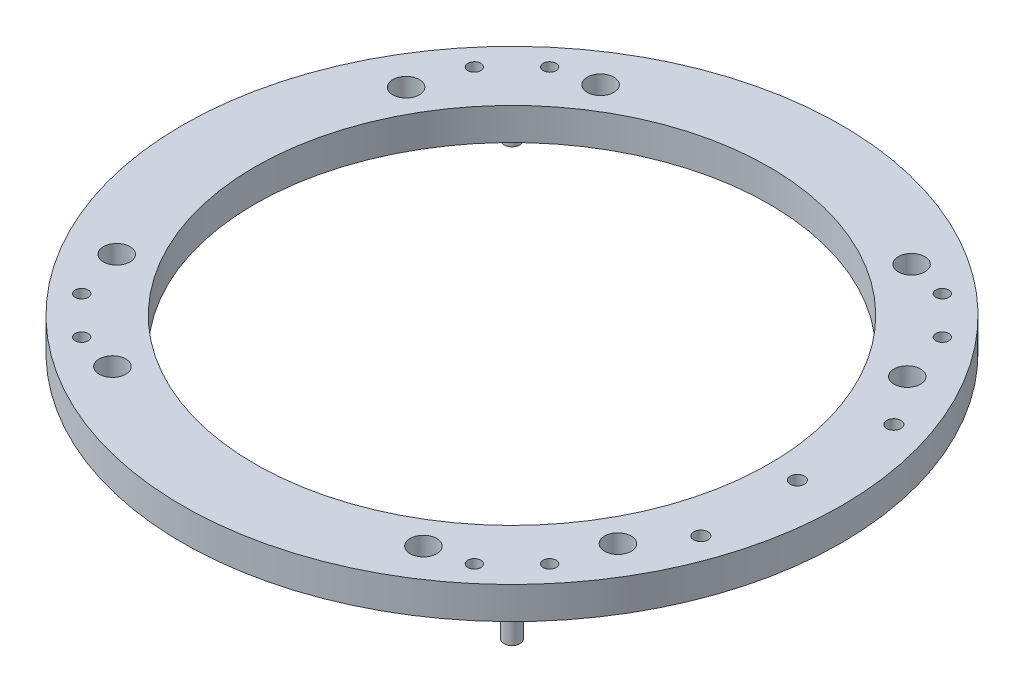
ISO-10303-21;
HEADER;
FILE_DESCRIPTION(('STEP AP214'),'2;1');
FILE_NAME('part.step','',(''),(''),'','','');
FILE_SCHEMA(('AUTOMOTIVE_DESIGN { 1 0 10303 214 1 1 1 1 }'));
ENDSEC;
DATA;
#1=APPLICATION_CONTEXT('core data for automotive mechanical design processes');
#2=APPLICATION_PROTOCOL_DEFINITION('international standard','automotive_design',2000,#1);
#3=PRODUCT_CONTEXT('',#1,'mechanical');
#4=PRODUCT('Part','Part','',(#3));
#5=PRODUCT_RELATED_PRODUCT_CATEGORY('part','',(#4));
#6=PRODUCT_DEFINITION_FORMATION('','',#4);
#7=PRODUCT_DEFINITION_CONTEXT('part definition',#1,'design');
#8=PRODUCT_DEFINITION('design','',#6,#7);
#9=PRODUCT_DEFINITION_SHAPE('','',#8);
#10=(LENGTH_UNIT() NAMED_UNIT(*) SI_UNIT(.MILLI.,.METRE.));
#11=(NAMED_UNIT(*) PLANE_ANGLE_UNIT() SI_UNIT($,.RADIAN.));
#12=(NAMED_UNIT(*) SI_UNIT($,.STERADIAN.) SOLID_ANGLE_UNIT());
#13=UNCERTAINTY_MEASURE_WITH_UNIT(LENGTH_MEASURE(1.E-05),#10,'distance_accuracy_value','');
#14=(GEOMETRIC_REPRESENTATION_CONTEXT(3) GLOBAL_UNCERTAINTY_ASSIGNED_CONTEXT((#13)) GLOBAL_UNIT_ASSIGNED_CONTEXT((#10,
#11,#12)) REPRESENTATION_CONTEXT('',''));
#15=CARTESIAN_POINT('',(0.,0.,0.));
#16=DIRECTION('',(0.,0.,1.));
#17=DIRECTION('',(1.,0.,0.));
#18=AXIS2_PLACEMENT_3D('',#15,#16,#17);
#19=CARTESIAN_POINT('',(0.,1057.275,0.));
#20=DIRECTION('',(0.,1.,0.));
#21=DIRECTION('',(-1.,0.,0.));
#22=AXIS2_PLACEMENT_3D('',#19,#20,#21);
#23=PLANE('',#22);
#24=CARTESIAN_POINT('',(-98.9867036525652,1057.275,57.1499999999999));
#25=DIRECTION('',(0.,1.,0.));
#26=DIRECTION('',(-1.,0.,0.));
#27=AXIS2_PLACEMENT_3D('',#24,#25,#26);
#28=CIRCLE('',#27,5.2451);
#29=CARTESIAN_POINT('',(-104.231803652565,1057.275,57.1499999999999));
#30=VERTEX_POINT('',#29);
#31=EDGE_CURVE('E394',#30,#30,#28,.T.);
#32=ORIENTED_EDGE('',*,*,#31,.T.);
#33=EDGE_LOOP('',(#32));
#34=FACE_BOUND('',#33,.T.);
#35=CARTESIAN_POINT('',(98.9867036525577,1057.275,57.1499999999999));
#36=DIRECTION('',(0.,1.,0.));
#37=DIRECTION('',(-1.,0.,0.));
#38=AXIS2_PLACEMENT_3D('',#35,#36,#37);
#39=CIRCLE('',#38,5.2451);
#40=CARTESIAN_POINT('',(93.7416036525577,1057.275,57.1499999999999));
#41=VERTEX_POINT('',#40);
#42=EDGE_CURVE('E398',#41,#41,#39,.T.);
#43=ORIENTED_EDGE('',*,*,#42,.T.);
#44=EDGE_LOOP('',(#43));
#45=FACE_BOUND('',#44,.T.);
#46=CARTESIAN_POINT('',(98.9867036525576,1057.275,-57.1499999999998));
#47=DIRECTION('',(0.,1.,0.));
#48=DIRECTION('',(-1.,0.,0.));
#49=AXIS2_PLACEMENT_3D('',#46,#47,#48);
#50=CIRCLE('',#49,5.2451);
#51=CARTESIAN_POINT('',(93.7416036525576,1057.275,-57.1499999999998));
#52=VERTEX_POINT('',#51);
#53=EDGE_CURVE('E405',#52,#52,#50,.T.);
#54=ORIENTED_EDGE('',*,*,#53,.T.);
#55=EDGE_LOOP('',(#54));
#56=FACE_BOUND('',#55,.T.);
#57=CARTESIAN_POINT('',(-98.9867036525651,1057.275,-57.1499999999998));
#58=DIRECTION('',(0.,1.,0.));
#59=DIRECTION('',(-1.,0.,0.));
#60=AXIS2_PLACEMENT_3D('',#57,#58,#59);
#61=CIRCLE('',#60,5.2451);
#62=CARTESIAN_POINT('',(-104.231803652565,1057.275,-57.1499999999998));
#63=VERTEX_POINT('',#62);
#64=EDGE_CURVE('E43',#63,#63,#61,.T.);
#65=ORIENTED_EDGE('',*,*,#64,.T.);
#66=EDGE_LOOP('',(#65));
#67=FACE_BOUND('',#66,.T.);
#68=CARTESIAN_POINT('',(-61.4133452340455,1057.275,-96.399642256413));
#69=DIRECTION('',(0.,1.,0.));
#70=DIRECTION('',(-1.,0.,0.));
#71=AXIS2_PLACEMENT_3D('',#68,#69,#70);
#72=CIRCLE('',#71,5.2451);
#73=CARTESIAN_POINT('',(-66.6584452340455,1057.275,-96.399642256413));
#74=VERTEX_POINT('',#73);
#75=EDGE_CURVE('E83',#74,#74,#72,.T.);
#76=ORIENTED_EDGE('',*,*,#75,.T.);
#77=EDGE_LOOP('',(#76));
#78=FACE_BOUND('',#77,.T.);
#79=CARTESIAN_POINT('',(61.413345234038,1057.275,-96.399642256413));
#80=DIRECTION('',(0.,1.,0.));
#81=DIRECTION('',(-1.,0.,0.));
#82=AXIS2_PLACEMENT_3D('',#79,#80,#81);
#83=CIRCLE('',#82,5.2451);
#84=CARTESIAN_POINT('',(56.168245234038,1057.275,-96.399642256413));
#85=VERTEX_POINT('',#84);
#86=EDGE_CURVE('E73',#85,#85,#83,.T.);
#87=ORIENTED_EDGE('',*,*,#86,.T.);
#88=EDGE_LOOP('',(#87));
#89=FACE_BOUND('',#88,.T.);
#90=CARTESIAN_POINT('',(61.413345234038,1057.275,96.399642256413));
#91=DIRECTION('',(0.,1.,0.));
#92=DIRECTION('',(-1.,0.,0.));
#93=AXIS2_PLACEMENT_3D('',#90,#91,#92);
#94=CIRCLE('',#93,5.2451);
#95=CARTESIAN_POINT('',(56.1682452340381,1057.275,96.399642256413));
#96=VERTEX_POINT('',#95);
#97=EDGE_CURVE('E80',#96,#96,#94,.T.);
#98=ORIENTED_EDGE('',*,*,#97,.T.);
#99=EDGE_LOOP('',(#98));
#100=FACE_BOUND('',#99,.T.);
#101=CARTESIAN_POINT('',(-61.4133452340455,1057.275,96.399642256413));
#102=DIRECTION('',(0.,1.,0.));
#103=DIRECTION('',(-1.,0.,0.));
#104=AXIS2_PLACEMENT_3D('',#101,#102,#103);
#105=CIRCLE('',#104,5.2451);
#106=CARTESIAN_POINT('',(-66.6584452340455,1057.275,96.399642256413));
#107=VERTEX_POINT('',#106);
#108=EDGE_CURVE('E69',#107,#107,#105,.T.);
#109=ORIENTED_EDGE('',*,*,#108,.T.);
#110=EDGE_LOOP('',(#109));
#111=FACE_BOUND('',#110,.T.);
#112=CARTESIAN_POINT('',(112.712499999997,1057.275,-38.1));
#113=DIRECTION('',(0.,1.,0.));
#114=DIRECTION('',(-1.,0.,0.));
#115=AXIS2_PLACEMENT_3D('',#112,#113,#114);
#116=CIRCLE('',#115,2.80669999999999);
#117=CARTESIAN_POINT('',(109.905799999997,1057.275,-38.1));
#118=VERTEX_POINT('',#117);
#119=EDGE_CURVE('E65',#118,#118,#116,.T.);
#120=ORIENTED_EDGE('',*,*,#119,.T.);
#121=EDGE_LOOP('',(#120));
#122=FACE_BOUND('',#121,.T.);
#123=CARTESIAN_POINT('',(112.712499999997,1057.275,0.));
#124=DIRECTION('',(0.,1.,0.));
#125=DIRECTION('',(-1.,0.,0.));
#126=AXIS2_PLACEMENT_3D('',#123,#124,#125);
#127=CIRCLE('',#126,2.8067);
#128=CARTESIAN_POINT('',(109.905799999997,1057.275,0.));
#129=VERTEX_POINT('',#128);
#130=EDGE_CURVE('E61',#129,#129,#127,.T.);
#131=ORIENTED_EDGE('',*,*,#130,.T.);
#132=EDGE_LOOP('',(#131));
#133=FACE_BOUND('',#132,.T.);
#134=CARTESIAN_POINT('',(112.712499999997,1057.275,38.1));
#135=DIRECTION('',(0.,1.,0.));
#136=DIRECTION('',(-1.,0.,0.));
#137=AXIS2_PLACEMENT_3D('',#134,#135,#136);
#138=CIRCLE('',#137,2.8067);
#139=CARTESIAN_POINT('',(109.905799999997,1057.275,38.1));
#140=VERTEX_POINT('',#139);
#141=EDGE_CURVE('E56',#140,#140,#138,.T.);
#142=ORIENTED_EDGE('',*,*,#141,.T.);
#143=EDGE_LOOP('',(#142));
#144=FACE_BOUND('',#143,.T.);
#145=CARTESIAN_POINT('',(92.4232620623001,1057.275,-77.5523251086821));
#146=DIRECTION('',(0.,-1.,0.));
#147=DIRECTION('',(0.,0.,-1.));
#148=AXIS2_PLACEMENT_3D('',#145,#146,#147);
#149=CIRCLE('',#148,2.55269999999999);
#150=CARTESIAN_POINT('',(92.4232620623001,1057.275,-80.1050251086821));
#151=VERTEX_POINT('',#150);
#152=EDGE_CURVE('E59',#151,#151,#149,.T.);
#153=ORIENTED_EDGE('',*,*,#152,.F.);
#154=EDGE_LOOP('',(#153));
#155=FACE_BOUND('',#154,.T.);
#156=CARTESIAN_POINT('',(77.5523251086762,1057.275,-92.4232620623057));
#157=DIRECTION('',(0.,-1.,0.));
#158=DIRECTION('',(0.,0.,-1.));
#159=AXIS2_PLACEMENT_3D('',#156,#157,#158);
#160=CIRCLE('',#159,2.55269999999999);
#161=CARTESIAN_POINT('',(77.5523251086762,1057.275,-94.9759620623057));
#162=VERTEX_POINT('',#161);
#163=EDGE_CURVE('E107',#162,#162,#160,.T.);
#164=ORIENTED_EDGE('',*,*,#163,.F.);
#165=EDGE_LOOP('',(#164));
#166=FACE_BOUND('',#165,.T.);
#167=CARTESIAN_POINT('',(77.5523251086775,1057.275,92.4232620623047));
#168=DIRECTION('',(0.,-1.,0.));
#169=DIRECTION('',(0.,0.,-1.));
#170=AXIS2_PLACEMENT_3D('',#167,#168,#169);
#171=CIRCLE('',#170,2.55269999999999);
#172=CARTESIAN_POINT('',(77.5523251086775,1057.275,89.8705620623047));
#173=VERTEX_POINT('',#172);
#174=EDGE_CURVE('E113',#173,#173,#171,.T.);
#175=ORIENTED_EDGE('',*,*,#174,.F.);
#176=EDGE_LOOP('',(#175));
#177=FACE_BOUND('',#176,.T.);
#178=CARTESIAN_POINT('',(92.4232620623012,1057.275,77.5523251086808));
#179=DIRECTION('',(0.,-1.,0.));
#180=DIRECTION('',(0.,0.,-1.));
#181=AXIS2_PLACEMENT_3D('',#178,#179,#180);
#182=CIRCLE('',#181,2.55269999999999);
#183=CARTESIAN_POINT('',(92.4232620623012,1057.275,74.9996251086808));
#184=VERTEX_POINT('',#183);
#185=EDGE_CURVE('E119',#184,#184,#182,.T.);
#186=ORIENTED_EDGE('',*,*,#185,.F.);
#187=EDGE_LOOP('',(#186));
#188=FACE_BOUND('',#187,.T.);
#189=CARTESIAN_POINT('',(-92.4232620623081,1057.275,77.5523251086815));
#190=DIRECTION('',(0.,-1.,0.));
#191=DIRECTION('',(0.,0.,-1.));
#192=AXIS2_PLACEMENT_3D('',#189,#190,#191);
#193=CIRCLE('',#192,2.55269999999999);
#194=CARTESIAN_POINT('',(-92.4232620623081,1057.275,74.9996251086815));
#195=VERTEX_POINT('',#194);
#196=EDGE_CURVE('E125',#195,#195,#193,.T.);
#197=ORIENTED_EDGE('',*,*,#196,.F.);
#198=EDGE_LOOP('',(#197));
#199=FACE_BOUND('',#198,.T.);
#200=CARTESIAN_POINT('',(-77.5523251086848,1057.275,-92.4232620623047));
#201=DIRECTION('',(0.,-1.,0.));
#202=DIRECTION('',(0.,0.,-1.));
#203=AXIS2_PLACEMENT_3D('',#200,#201,#202);
#204=CIRCLE('',#203,2.55269999999999);
#205=CARTESIAN_POINT('',(-77.5523251086848,1057.275,-94.9759620623046));
#206=VERTEX_POINT('',#205);
#207=EDGE_CURVE('E140',#206,#206,#204,.T.);
#208=ORIENTED_EDGE('',*,*,#207,.F.);
#209=EDGE_LOOP('',(#208));
#210=FACE_BOUND('',#209,.T.);
#211=CARTESIAN_POINT('',(-92.4232620623086,1057.275,-77.5523251086808));
#212=DIRECTION('',(0.,-1.,0.));
#213=DIRECTION('',(0.,0.,-1.));
#214=AXIS2_PLACEMENT_3D('',#211,#212,#213);
#215=CIRCLE('',#214,2.55269999999999);
#216=CARTESIAN_POINT('',(-92.4232620623086,1057.275,-80.1050251086808));
#217=VERTEX_POINT('',#216);
#218=EDGE_CURVE('E146',#217,#217,#215,.T.);
#219=ORIENTED_EDGE('',*,*,#218,.F.);
#220=EDGE_LOOP('',(#219));
#221=FACE_BOUND('',#220,.T.);
#222=CARTESIAN_POINT('',(-85.3124331501608,1057.275,-85.3124331501569));
#223=DIRECTION('',(0.,1.,0.));
#224=DIRECTION('',(-1.,0.,0.));
#225=AXIS2_PLACEMENT_3D('',#222,#223,#224);
#226=CIRCLE('',#225,3.175);
#227=CARTESIAN_POINT('',(-88.4874331501608,1057.275,-85.3124331501569));
#228=VERTEX_POINT('',#227);
#229=EDGE_CURVE('E10',#228,#228,#226,.F.);
#230=ORIENTED_EDGE('',*,*,#229,.F.);
#231=EDGE_LOOP('',(#230));
#232=FACE_BOUND('',#231,.T.);
#233=CARTESIAN_POINT('',(85.3124331501531,1057.275,-85.3124331501571));
#234=DIRECTION('',(0.,1.,0.));
#235=DIRECTION('',(-1.,0.,0.));
#236=AXIS2_PLACEMENT_3D('',#233,#234,#235);
#237=CIRCLE('',#236,3.175);
#238=CARTESIAN_POINT('',(82.1374331501531,1057.275,-85.3124331501571));
#239=VERTEX_POINT('',#238);
#240=EDGE_CURVE('E47',#239,#239,#237,.F.);
#241=ORIENTED_EDGE('',*,*,#240,.F.);
#242=EDGE_LOOP('',(#241));
#243=FACE_BOUND('',#242,.T.);
#244=CARTESIAN_POINT('',(85.3124331501534,1057.275,85.3124331501568));
#245=DIRECTION('',(0.,1.,0.));
#246=DIRECTION('',(-1.,0.,0.));
#247=AXIS2_PLACEMENT_3D('',#244,#245,#246);
#248=CIRCLE('',#247,3.175);
#249=CARTESIAN_POINT('',(82.1374331501534,1057.275,85.3124331501568));
#250=VERTEX_POINT('',#249);
#251=EDGE_CURVE('E52',#250,#250,#248,.F.);
#252=ORIENTED_EDGE('',*,*,#251,.F.);
#253=EDGE_LOOP('',(#252));
#254=FACE_BOUND('',#253,.T.);
#255=CARTESIAN_POINT('',(-85.3124331501605,1057.275,85.3124331501571));
#256=DIRECTION('',(0.,1.,0.));
#257=DIRECTION('',(-1.,0.,0.));
#258=AXIS2_PLACEMENT_3D('',#255,#256,#257);
#259=CIRCLE('',#258,3.175);
#260=CARTESIAN_POINT('',(-88.4874331501605,1057.275,85.3124331501571));
#261=VERTEX_POINT('',#260);
#262=EDGE_CURVE('E181',#261,#261,#259,.F.);
#263=ORIENTED_EDGE('',*,*,#262,.F.);
#264=EDGE_LOOP('',(#263));
#265=FACE_BOUND('',#264,.T.);
#266=CARTESIAN_POINT('',(-3.69750480233591E-12,1057.275,0.));
#267=DIRECTION('',(0.,1.,0.));
#268=DIRECTION('',(-1.,0.,0.));
#269=AXIS2_PLACEMENT_3D('',#266,#267,#268);
#270=CIRCLE('',#269,130.175000000004);
#271=CARTESIAN_POINT('',(-130.175000000008,1057.275,0.));
#272=VERTEX_POINT('',#271);
#273=EDGE_CURVE('E165',#272,#272,#270,.T.);
#274=ORIENTED_EDGE('',*,*,#273,.F.);
#275=EDGE_LOOP('',(#274));
#276=FACE_BOUND('',#275,.T.);
#277=CARTESIAN_POINT('',(-3.69750480233591E-12,1057.275,0.));
#278=DIRECTION('',(0.,1.,0.));
#279=DIRECTION('',(-1.,0.,0.));
#280=AXIS2_PLACEMENT_3D('',#277,#278,#279);
#281=CIRCLE('',#280,101.600000000001);
#282=CARTESIAN_POINT('',(-101.600000000004,1057.275,0.));
#283=VERTEX_POINT('',#282);
#284=EDGE_CURVE('E169',#283,#283,#281,.T.);
#285=ORIENTED_EDGE('',*,*,#284,.T.);
#286=EDGE_LOOP('',(#285));
#287=FACE_BOUND('',#286,.T.);
#288=CARTESIAN_POINT('',(-77.5523251086842,1057.275,92.4232620623052));
#289=DIRECTION('',(0.,-1.,0.));
#290=DIRECTION('',(0.,0.,-1.));
#291=AXIS2_PLACEMENT_3D('',#288,#289,#290);
#292=CIRCLE('',#291,2.55269999999999);
#293=CARTESIAN_POINT('',(-77.5523251086842,1057.275,89.8705620623052));
#294=VERTEX_POINT('',#293);
#295=EDGE_CURVE('E132',#294,#294,#292,.T.);
#296=ORIENTED_EDGE('',*,*,#295,.F.);
#297=EDGE_LOOP('',(#296));
#298=FACE_BOUND('',#297,.T.);
#299=ADVANCED_FACE('F39',(#34,#45,#56,#67,#78,#89,#100,#111,#122,#133,#144,#155,#166,#177,#188,
#199,#210,#221,#232,#243,#254,#265,#276,#287,#298),#23,.F.);
#300=CARTESIAN_POINT('',(0.,1069.975,0.));
#301=DIRECTION('',(0.,1.,0.));
#302=DIRECTION('',(-1.,0.,0.));
#303=AXIS2_PLACEMENT_3D('',#300,#301,#302);
#304=PLANE('',#303);
#305=CARTESIAN_POINT('',(-98.9867036525652,1069.975,57.1499999999999));
#306=DIRECTION('',(0.,1.,0.));
#307=DIRECTION('',(0.,0.,1.));
#308=AXIS2_PLACEMENT_3D('',#305,#306,#307);
#309=CIRCLE('',#308,5.2451);
#310=CARTESIAN_POINT('',(-98.9867036525652,1069.975,62.3950999999999));
#311=VERTEX_POINT('',#310);
#312=EDGE_CURVE('E267',#311,#311,#309,.T.);
#313=ORIENTED_EDGE('',*,*,#312,.F.);
#314=EDGE_LOOP('',(#313));
#315=FACE_BOUND('',#314,.T.);
#316=CARTESIAN_POINT('',(98.9867036525577,1069.975,57.1499999999999));
#317=DIRECTION('',(0.,1.,0.));
#318=DIRECTION('',(0.,0.,1.));
#319=AXIS2_PLACEMENT_3D('',#316,#317,#318);
#320=CIRCLE('',#319,5.2451);
#321=CARTESIAN_POINT('',(98.9867036525577,1069.975,62.3950999999999));
#322=VERTEX_POINT('',#321);
#323=EDGE_CURVE('E271',#322,#322,#320,.T.);
#324=ORIENTED_EDGE('',*,*,#323,.F.);
#325=EDGE_LOOP('',(#324));
#326=FACE_BOUND('',#325,.T.);
#327=CARTESIAN_POINT('',(98.9867036525576,1069.975,-57.1499999999998));
#328=DIRECTION('',(0.,1.,0.));
#329=DIRECTION('',(0.,0.,1.));
#330=AXIS2_PLACEMENT_3D('',#327,#328,#329);
#331=CIRCLE('',#330,5.2451);
#332=CARTESIAN_POINT('',(98.9867036525576,1069.975,-51.9048999999998));
#333=VERTEX_POINT('',#332);
#334=EDGE_CURVE('E275',#333,#333,#331,.T.);
#335=ORIENTED_EDGE('',*,*,#334,.F.);
#336=EDGE_LOOP('',(#335));
#337=FACE_BOUND('',#336,.T.);
#338=CARTESIAN_POINT('',(-98.9867036525651,1069.975,-57.1499999999998));
#339=DIRECTION('',(0.,1.,0.));
#340=DIRECTION('',(0.,0.,1.));
#341=AXIS2_PLACEMENT_3D('',#338,#339,#340);
#342=CIRCLE('',#341,5.2451);
#343=CARTESIAN_POINT('',(-98.9867036525651,1069.975,-51.9048999999998));
#344=VERTEX_POINT('',#343);
#345=EDGE_CURVE('E279',#344,#344,#342,.T.);
#346=ORIENTED_EDGE('',*,*,#345,.F.);
#347=EDGE_LOOP('',(#346));
#348=FACE_BOUND('',#347,.T.);
#349=CARTESIAN_POINT('',(-61.4133452340455,1069.975,-96.399642256413));
#350=DIRECTION('',(0.,1.,0.));
#351=DIRECTION('',(0.,0.,1.));
#352=AXIS2_PLACEMENT_3D('',#349,#350,#351);
#353=CIRCLE('',#352,5.2451);
#354=CARTESIAN_POINT('',(-61.4133452340455,1069.975,-91.154542256413));
#355=VERTEX_POINT('',#354);
#356=EDGE_CURVE('E88',#355,#355,#353,.T.);
#357=ORIENTED_EDGE('',*,*,#356,.F.);
#358=EDGE_LOOP('',(#357));
#359=FACE_BOUND('',#358,.T.);
#360=CARTESIAN_POINT('',(61.413345234038,1069.975,-96.399642256413));
#361=DIRECTION('',(0.,1.,0.));
#362=DIRECTION('',(0.,0.,1.));
#363=AXIS2_PLACEMENT_3D('',#360,#361,#362);
#364=CIRCLE('',#363,5.2451);
#365=CARTESIAN_POINT('',(61.413345234038,1069.975,-91.154542256413));
#366=VERTEX_POINT('',#365);
#367=EDGE_CURVE('E76',#366,#366,#364,.T.);
#368=ORIENTED_EDGE('',*,*,#367,.F.);
#369=EDGE_LOOP('',(#368));
#370=FACE_BOUND('',#369,.T.);
#371=CARTESIAN_POINT('',(61.413345234038,1069.975,96.399642256413));
#372=DIRECTION('',(0.,1.,0.));
#373=DIRECTION('',(0.,0.,1.));
#374=AXIS2_PLACEMENT_3D('',#371,#372,#373);
#375=CIRCLE('',#374,5.2451);
#376=CARTESIAN_POINT('',(61.413345234038,1069.975,101.644742256413));
#377=VERTEX_POINT('',#376);
#378=EDGE_CURVE('E75',#377,#377,#375,.T.);
#379=ORIENTED_EDGE('',*,*,#378,.F.);
#380=EDGE_LOOP('',(#379));
#381=FACE_BOUND('',#380,.T.);
#382=CARTESIAN_POINT('',(-61.4133452340455,1069.975,96.399642256413));
#383=DIRECTION('',(0.,1.,0.));
#384=DIRECTION('',(0.,0.,1.));
#385=AXIS2_PLACEMENT_3D('',#382,#383,#384);
#386=CIRCLE('',#385,5.2451);
#387=CARTESIAN_POINT('',(-61.4133452340455,1069.975,101.644742256413));
#388=VERTEX_POINT('',#387);
#389=EDGE_CURVE('E72',#388,#388,#386,.T.);
#390=ORIENTED_EDGE('',*,*,#389,.F.);
#391=EDGE_LOOP('',(#390));
#392=FACE_BOUND('',#391,.T.);
#393=CARTESIAN_POINT('',(112.712499999997,1069.975,-38.1));
#394=DIRECTION('',(0.,1.,0.));
#395=DIRECTION('',(0.,0.,1.));
#396=AXIS2_PLACEMENT_3D('',#393,#394,#395);
#397=CIRCLE('',#396,2.80669999999998);
#398=CARTESIAN_POINT('',(112.712499999997,1069.975,-35.2933));
#399=VERTEX_POINT('',#398);
#400=EDGE_CURVE('E68',#399,#399,#397,.T.);
#401=ORIENTED_EDGE('',*,*,#400,.F.);
#402=EDGE_LOOP('',(#401));
#403=FACE_BOUND('',#402,.T.);
#404=CARTESIAN_POINT('',(112.712499999997,1069.975,0.));
#405=DIRECTION('',(0.,1.,0.));
#406=DIRECTION('',(0.,0.,1.));
#407=AXIS2_PLACEMENT_3D('',#404,#405,#406);
#408=CIRCLE('',#407,2.8067);
#409=CARTESIAN_POINT('',(112.712499999997,1069.975,2.8067));
#410=VERTEX_POINT('',#409);
#411=EDGE_CURVE('E64',#410,#410,#408,.T.);
#412=ORIENTED_EDGE('',*,*,#411,.F.);
#413=EDGE_LOOP('',(#412));
#414=FACE_BOUND('',#413,.T.);
#415=CARTESIAN_POINT('',(112.712499999997,1069.975,38.1));
#416=DIRECTION('',(0.,1.,0.));
#417=DIRECTION('',(0.,0.,1.));
#418=AXIS2_PLACEMENT_3D('',#415,#416,#417);
#419=CIRCLE('',#418,2.8067);
#420=CARTESIAN_POINT('',(112.712499999997,1069.975,40.9067));
#421=VERTEX_POINT('',#420);
#422=EDGE_CURVE('E60',#421,#421,#419,.T.);
#423=ORIENTED_EDGE('',*,*,#422,.F.);
#424=EDGE_LOOP('',(#423));
#425=FACE_BOUND('',#424,.T.);
#426=CARTESIAN_POINT('',(92.4232620623001,1069.975,-77.5523251086821));
#427=DIRECTION('',(0.,-1.,0.));
#428=DIRECTION('',(0.,0.,-1.));
#429=AXIS2_PLACEMENT_3D('',#426,#427,#428);
#430=CIRCLE('',#429,2.55269999999999);
#431=CARTESIAN_POINT('',(92.4232620623001,1069.975,-80.1050251086821));
#432=VERTEX_POINT('',#431);
#433=EDGE_CURVE('E104',#432,#432,#430,.T.);
#434=ORIENTED_EDGE('',*,*,#433,.T.);
#435=EDGE_LOOP('',(#434));
#436=FACE_BOUND('',#435,.T.);
#437=CARTESIAN_POINT('',(77.5523251086762,1069.975,-92.4232620623057));
#438=DIRECTION('',(0.,-1.,0.));
#439=DIRECTION('',(0.,0.,-1.));
#440=AXIS2_PLACEMENT_3D('',#437,#438,#439);
#441=CIRCLE('',#440,2.55269999999999);
#442=CARTESIAN_POINT('',(77.5523251086762,1069.975,-94.9759620623057));
#443=VERTEX_POINT('',#442);
#444=EDGE_CURVE('E110',#443,#443,#441,.T.);
#445=ORIENTED_EDGE('',*,*,#444,.T.);
#446=EDGE_LOOP('',(#445));
#447=FACE_BOUND('',#446,.T.);
#448=CARTESIAN_POINT('',(77.5523251086775,1069.975,92.4232620623047));
#449=DIRECTION('',(0.,-1.,0.));
#450=DIRECTION('',(0.,0.,-1.));
#451=AXIS2_PLACEMENT_3D('',#448,#449,#450);
#452=CIRCLE('',#451,2.55269999999999);
#453=CARTESIAN_POINT('',(77.5523251086775,1069.975,89.8705620623047));
#454=VERTEX_POINT('',#453);
#455=EDGE_CURVE('E116',#454,#454,#452,.T.);
#456=ORIENTED_EDGE('',*,*,#455,.T.);
#457=EDGE_LOOP('',(#456));
#458=FACE_BOUND('',#457,.T.);
#459=CARTESIAN_POINT('',(92.4232620623012,1069.975,77.5523251086808));
#460=DIRECTION('',(0.,-1.,0.));
#461=DIRECTION('',(0.,0.,-1.));
#462=AXIS2_PLACEMENT_3D('',#459,#460,#461);
#463=CIRCLE('',#462,2.55269999999999);
#464=CARTESIAN_POINT('',(92.4232620623012,1069.975,74.9996251086808));
#465=VERTEX_POINT('',#464);
#466=EDGE_CURVE('E122',#465,#465,#463,.T.);
#467=ORIENTED_EDGE('',*,*,#466,.T.);
#468=EDGE_LOOP('',(#467));
#469=FACE_BOUND('',#468,.T.);
#470=CARTESIAN_POINT('',(-92.4232620623081,1069.975,77.5523251086815));
#471=DIRECTION('',(0.,-1.,0.));
#472=DIRECTION('',(0.,0.,-1.));
#473=AXIS2_PLACEMENT_3D('',#470,#471,#472);
#474=CIRCLE('',#473,2.55269999999999);
#475=CARTESIAN_POINT('',(-92.4232620623081,1069.975,74.9996251086815));
#476=VERTEX_POINT('',#475);
#477=EDGE_CURVE('E128',#476,#476,#474,.T.);
#478=ORIENTED_EDGE('',*,*,#477,.T.);
#479=EDGE_LOOP('',(#478));
#480=FACE_BOUND('',#479,.T.);
#481=CARTESIAN_POINT('',(-77.5523251086842,1069.975,92.4232620623052));
#482=DIRECTION('',(0.,-1.,0.));
#483=DIRECTION('',(0.,0.,-1.));
#484=AXIS2_PLACEMENT_3D('',#481,#482,#483);
#485=CIRCLE('',#484,2.55269999999999);
#486=CARTESIAN_POINT('',(-77.5523251086842,1069.975,89.8705620623052));
#487=VERTEX_POINT('',#486);
#488=EDGE_CURVE('E136',#487,#487,#485,.T.);
#489=ORIENTED_EDGE('',*,*,#488,.T.);
#490=EDGE_LOOP('',(#489));
#491=FACE_BOUND('',#490,.T.);
#492=CARTESIAN_POINT('',(-3.74191927443602E-12,1069.975,0.));
#493=DIRECTION('',(0.,1.,0.));
#494=DIRECTION('',(-1.,0.,0.));
#495=AXIS2_PLACEMENT_3D('',#492,#493,#494);
#496=CIRCLE('',#495,101.600000000001);
#497=CARTESIAN_POINT('',(-101.600000000004,1069.975,0.));
#498=VERTEX_POINT('',#497);
#499=EDGE_CURVE('E173',#498,#498,#496,.T.);
#500=ORIENTED_EDGE('',*,*,#499,.F.);
#501=EDGE_LOOP('',(#500));
#502=FACE_BOUND('',#501,.T.);
#503=CARTESIAN_POINT('',(-3.74191927443602E-12,1069.975,0.));
#504=DIRECTION('',(0.,1.,0.));
#505=DIRECTION('',(-1.,0.,0.));
#506=AXIS2_PLACEMENT_3D('',#503,#504,#505);
#507=CIRCLE('',#506,130.175000000004);
#508=CARTESIAN_POINT('',(-130.175000000008,1069.975,0.));
#509=VERTEX_POINT('',#508);
#510=EDGE_CURVE('E177',#509,#509,#507,.T.);
#511=ORIENTED_EDGE('',*,*,#510,.T.);
#512=EDGE_LOOP('',(#511));
#513=FACE_BOUND('',#512,.T.);
#514=CARTESIAN_POINT('',(-92.4232620623086,1069.975,-77.5523251086808));
#515=DIRECTION('',(0.,-1.,0.));
#516=DIRECTION('',(0.,0.,-1.));
#517=AXIS2_PLACEMENT_3D('',#514,#515,#516);
#518=CIRCLE('',#517,2.55269999999999);
#519=CARTESIAN_POINT('',(-92.4232620623086,1069.975,-80.1050251086808));
#520=VERTEX_POINT('',#519);
#521=EDGE_CURVE('E149',#520,#520,#518,.T.);
#522=ORIENTED_EDGE('',*,*,#521,.T.);
#523=EDGE_LOOP('',(#522));
#524=FACE_BOUND('',#523,.T.);
#525=CARTESIAN_POINT('',(-77.5523251086848,1069.975,-92.4232620623047));
#526=DIRECTION('',(0.,-1.,0.));
#527=DIRECTION('',(0.,0.,-1.));
#528=AXIS2_PLACEMENT_3D('',#525,#526,#527);
#529=CIRCLE('',#528,2.55269999999999);
#530=CARTESIAN_POINT('',(-77.5523251086848,1069.975,-94.9759620623046));
#531=VERTEX_POINT('',#530);
#532=EDGE_CURVE('E143',#531,#531,#529,.T.);
#533=ORIENTED_EDGE('',*,*,#532,.T.);
#534=EDGE_LOOP('',(#533));
#535=FACE_BOUND('',#534,.T.);
#536=ADVANCED_FACE('F191',(#315,#326,#337,#348,#359,#370,#381,#392,#403,#414,#425,#436,#447,
#458,#469,#480,#491,#502,#513,#524,#535),#304,.T.);
#537=CARTESIAN_POINT('',(-3.93720365141906E-12,1125.81516808967,0.));
#538=DIRECTION('',(0.,1.,0.));
#539=DIRECTION('',(-1.,0.,0.));
#540=AXIS2_PLACEMENT_3D('',#537,#538,#539);
#541=CYLINDRICAL_SURFACE('',#540,130.175000000004);
#542=ORIENTED_EDGE('',*,*,#273,.T.);
#543=EDGE_LOOP('',(#542));
#544=FACE_BOUND('',#543,.T.);
#545=ORIENTED_EDGE('',*,*,#510,.F.);
#546=EDGE_LOOP('',(#545));
#547=FACE_BOUND('',#546,.T.);
#548=ADVANCED_FACE('F41',(#544,#547),#541,.T.);
#549=CARTESIAN_POINT('',(-3.93720365141906E-12,1125.81516808967,0.));
#550=DIRECTION('',(0.,1.,0.));
#551=DIRECTION('',(-1.,0.,0.));
#552=AXIS2_PLACEMENT_3D('',#549,#550,#551);
#553=CYLINDRICAL_SURFACE('',#552,101.600000000001);
#554=ORIENTED_EDGE('',*,*,#284,.F.);
#555=EDGE_LOOP('',(#554));
#556=FACE_BOUND('',#555,.T.);
#557=ORIENTED_EDGE('',*,*,#499,.T.);
#558=EDGE_LOOP('',(#557));
#559=FACE_BOUND('',#558,.T.);
#560=ADVANCED_FACE('F253',(#556,#559),#553,.F.);
#561=CARTESIAN_POINT('',(-85.3124331501605,1044.575,85.3124331501571));
#562=DIRECTION('',(0.,1.,0.));
#563=DIRECTION('',(-1.,0.,0.));
#564=AXIS2_PLACEMENT_3D('',#561,#562,#563);
#565=CYLINDRICAL_SURFACE('',#564,3.175);
#566=CARTESIAN_POINT('',(-85.3124331501605,1044.575,85.3124331501571));
#567=DIRECTION('',(0.,-1.,0.));
#568=DIRECTION('',(1.,0.,0.));
#569=AXIS2_PLACEMENT_3D('',#566,#567,#568);
#570=CIRCLE('',#569,3.175);
#571=CARTESIAN_POINT('',(-82.1374331501605,1044.575,85.3124331501571));
#572=VERTEX_POINT('',#571);
#573=EDGE_CURVE('E162',#572,#572,#570,.T.);
#574=ORIENTED_EDGE('',*,*,#573,.F.);
#575=EDGE_LOOP('',(#574));
#576=FACE_BOUND('',#575,.T.);
#577=ORIENTED_EDGE('',*,*,#262,.T.);
#578=EDGE_LOOP('',(#577));
#579=FACE_BOUND('',#578,.T.);
#580=ADVANCED_FACE('F250',(#576,#579),#565,.T.);
#581=CARTESIAN_POINT('',(-85.3124331501605,1044.575,85.3124331501571));
#582=DIRECTION('',(0.,-1.,0.));
#583=DIRECTION('',(1.,0.,0.));
#584=AXIS2_PLACEMENT_3D('',#581,#582,#583);
#585=PLANE('',#584);
#586=ORIENTED_EDGE('',*,*,#573,.T.);
#587=EDGE_LOOP('',(#586));
#588=FACE_BOUND('',#587,.T.);
#589=ADVANCED_FACE('F246',(#588),#585,.T.);
#590=CARTESIAN_POINT('',(85.3124331501535,1044.575,85.3124331501568));
#591=DIRECTION('',(0.,1.,0.));
#592=DIRECTION('',(-1.,0.,0.));
#593=AXIS2_PLACEMENT_3D('',#590,#591,#592);
#594=CYLINDRICAL_SURFACE('',#593,3.175);
#595=CARTESIAN_POINT('',(85.3124331501535,1044.575,85.3124331501568));
#596=DIRECTION('',(0.,-1.,0.));
#597=DIRECTION('',(1.,0.,0.));
#598=AXIS2_PLACEMENT_3D('',#595,#596,#597);
#599=CIRCLE('',#598,3.175);
#600=CARTESIAN_POINT('',(88.4874331501534,1044.575,85.3124331501568));
#601=VERTEX_POINT('',#600);
#602=EDGE_CURVE('E159',#601,#601,#599,.T.);
#603=ORIENTED_EDGE('',*,*,#602,.F.);
#604=EDGE_LOOP('',(#603));
#605=FACE_BOUND('',#604,.T.);
#606=ORIENTED_EDGE('',*,*,#251,.T.);
#607=EDGE_LOOP('',(#606));
#608=FACE_BOUND('',#607,.T.);
#609=ADVANCED_FACE('F187',(#605,#608),#594,.T.);
#610=CARTESIAN_POINT('',(85.3124331501535,1044.575,85.3124331501568));
#611=DIRECTION('',(0.,-1.,0.));
#612=DIRECTION('',(1.,0.,0.));
#613=AXIS2_PLACEMENT_3D('',#610,#611,#612);
#614=PLANE('',#613);
#615=ORIENTED_EDGE('',*,*,#602,.T.);
#616=EDGE_LOOP('',(#615));
#617=FACE_BOUND('',#616,.T.);
#618=ADVANCED_FACE('F239',(#617),#614,.T.);
#619=CARTESIAN_POINT('',(85.3124331501531,1044.575,-85.3124331501571));
#620=DIRECTION('',(0.,1.,0.));
#621=DIRECTION('',(-1.,0.,0.));
#622=AXIS2_PLACEMENT_3D('',#619,#620,#621);
#623=CYLINDRICAL_SURFACE('',#622,3.175);
#624=CARTESIAN_POINT('',(85.3124331501531,1044.575,-85.3124331501571));
#625=DIRECTION('',(0.,-1.,0.));
#626=DIRECTION('',(1.,0.,0.));
#627=AXIS2_PLACEMENT_3D('',#624,#625,#626);
#628=CIRCLE('',#627,3.175);
#629=CARTESIAN_POINT('',(88.4874331501531,1044.575,-85.3124331501571));
#630=VERTEX_POINT('',#629);
#631=EDGE_CURVE('E155',#630,#630,#628,.T.);
#632=ORIENTED_EDGE('',*,*,#631,.F.);
#633=EDGE_LOOP('',(#632));
#634=FACE_BOUND('',#633,.T.);
#635=ORIENTED_EDGE('',*,*,#240,.T.);
#636=EDGE_LOOP('',(#635));
#637=FACE_BOUND('',#636,.T.);
#638=ADVANCED_FACE('F235',(#634,#637),#623,.T.);
#639=CARTESIAN_POINT('',(85.3124331501531,1044.575,-85.3124331501571));
#640=DIRECTION('',(0.,-1.,0.));
#641=DIRECTION('',(1.,0.,0.));
#642=AXIS2_PLACEMENT_3D('',#639,#640,#641);
#643=PLANE('',#642);
#644=ORIENTED_EDGE('',*,*,#631,.T.);
#645=EDGE_LOOP('',(#644));
#646=FACE_BOUND('',#645,.T.);
#647=ADVANCED_FACE('F231',(#646),#643,.T.);
#648=CARTESIAN_POINT('',(-85.3124331501608,1044.575,-85.3124331501569));
#649=DIRECTION('',(0.,1.,0.));
#650=DIRECTION('',(-1.,0.,0.));
#651=AXIS2_PLACEMENT_3D('',#648,#649,#650);
#652=CYLINDRICAL_SURFACE('',#651,3.175);
#653=CARTESIAN_POINT('',(-85.3124331501608,1044.575,-85.3124331501569));
#654=DIRECTION('',(0.,-1.,0.));
#655=DIRECTION('',(1.,0.,0.));
#656=AXIS2_PLACEMENT_3D('',#653,#654,#655);
#657=CIRCLE('',#656,3.175);
#658=CARTESIAN_POINT('',(-82.1374331501608,1044.575,-85.3124331501569));
#659=VERTEX_POINT('',#658);
#660=EDGE_CURVE('E152',#659,#659,#657,.T.);
#661=ORIENTED_EDGE('',*,*,#660,.F.);
#662=EDGE_LOOP('',(#661));
#663=FACE_BOUND('',#662,.T.);
#664=ORIENTED_EDGE('',*,*,#229,.T.);
#665=EDGE_LOOP('',(#664));
#666=FACE_BOUND('',#665,.T.);
#667=ADVANCED_FACE('F227',(#663,#666),#652,.T.);
#668=CARTESIAN_POINT('',(-85.3124331501608,1044.575,-85.3124331501569));
#669=DIRECTION('',(0.,-1.,0.));
#670=DIRECTION('',(1.,0.,0.));
#671=AXIS2_PLACEMENT_3D('',#668,#669,#670);
#672=PLANE('',#671);
#673=ORIENTED_EDGE('',*,*,#660,.T.);
#674=EDGE_LOOP('',(#673));
#675=FACE_BOUND('',#674,.T.);
#676=ADVANCED_FACE('F223',(#675),#672,.T.);
#677=CARTESIAN_POINT('',(-92.4232620623086,1057.275,-77.5523251086808));
#678=DIRECTION('',(0.,-1.,0.));
#679=DIRECTION('',(0.,0.,-1.));
#680=AXIS2_PLACEMENT_3D('',#677,#678,#679);
#681=CYLINDRICAL_SURFACE('',#680,2.55269999999999);
#682=ORIENTED_EDGE('',*,*,#521,.F.);
#683=EDGE_LOOP('',(#682));
#684=FACE_BOUND('',#683,.T.);
#685=ORIENTED_EDGE('',*,*,#218,.T.);
#686=EDGE_LOOP('',(#685));
#687=FACE_BOUND('',#686,.T.);
#688=ADVANCED_FACE('F215',(#684,#687),#681,.F.);
#689=CARTESIAN_POINT('',(-77.5523251086848,1057.275,-92.4232620623047));
#690=DIRECTION('',(0.,-1.,0.));
#691=DIRECTION('',(0.,0.,-1.));
#692=AXIS2_PLACEMENT_3D('',#689,#690,#691);
#693=CYLINDRICAL_SURFACE('',#692,2.55269999999999);
#694=ORIENTED_EDGE('',*,*,#532,.F.);
#695=EDGE_LOOP('',(#694));
#696=FACE_BOUND('',#695,.T.);
#697=ORIENTED_EDGE('',*,*,#207,.T.);
#698=EDGE_LOOP('',(#697));
#699=FACE_BOUND('',#698,.T.);
#700=ADVANCED_FACE('F205',(#696,#699),#693,.F.);
#701=CARTESIAN_POINT('',(-77.5523251086842,1057.275,92.4232620623052));
#702=DIRECTION('',(0.,-1.,0.));
#703=DIRECTION('',(0.,0.,-1.));
#704=AXIS2_PLACEMENT_3D('',#701,#702,#703);
#705=CYLINDRICAL_SURFACE('',#704,2.55269999999999);
#706=ORIENTED_EDGE('',*,*,#488,.F.);
#707=EDGE_LOOP('',(#706));
#708=FACE_BOUND('',#707,.T.);
#709=ORIENTED_EDGE('',*,*,#295,.T.);
#710=EDGE_LOOP('',(#709));
#711=FACE_BOUND('',#710,.T.);
#712=ADVANCED_FACE('F202',(#708,#711),#705,.F.);
#713=CARTESIAN_POINT('',(-92.4232620623081,1057.275,77.5523251086815));
#714=DIRECTION('',(0.,-1.,0.));
#715=DIRECTION('',(0.,0.,-1.));
#716=AXIS2_PLACEMENT_3D('',#713,#714,#715);
#717=CYLINDRICAL_SURFACE('',#716,2.55269999999999);
#718=ORIENTED_EDGE('',*,*,#477,.F.);
#719=EDGE_LOOP('',(#718));
#720=FACE_BOUND('',#719,.T.);
#721=ORIENTED_EDGE('',*,*,#196,.T.);
#722=EDGE_LOOP('',(#721));
#723=FACE_BOUND('',#722,.T.);
#724=ADVANCED_FACE('F204',(#720,#723),#717,.F.);
#725=CARTESIAN_POINT('',(92.4232620623012,1057.275,77.5523251086808));
#726=DIRECTION('',(0.,-1.,0.));
#727=DIRECTION('',(0.,0.,-1.));
#728=AXIS2_PLACEMENT_3D('',#725,#726,#727);
#729=CYLINDRICAL_SURFACE('',#728,2.55269999999999);
#730=ORIENTED_EDGE('',*,*,#466,.F.);
#731=EDGE_LOOP('',(#730));
#732=FACE_BOUND('',#731,.T.);
#733=ORIENTED_EDGE('',*,*,#185,.T.);
#734=EDGE_LOOP('',(#733));
#735=FACE_BOUND('',#734,.T.);
#736=ADVANCED_FACE('F212',(#732,#735),#729,.F.);
#737=CARTESIAN_POINT('',(77.5523251086775,1057.275,92.4232620623047));
#738=DIRECTION('',(0.,-1.,0.));
#739=DIRECTION('',(0.,0.,-1.));
#740=AXIS2_PLACEMENT_3D('',#737,#738,#739);
#741=CYLINDRICAL_SURFACE('',#740,2.55269999999999);
#742=ORIENTED_EDGE('',*,*,#455,.F.);
#743=EDGE_LOOP('',(#742));
#744=FACE_BOUND('',#743,.T.);
#745=ORIENTED_EDGE('',*,*,#174,.T.);
#746=EDGE_LOOP('',(#745));
#747=FACE_BOUND('',#746,.T.);
#748=ADVANCED_FACE('F330',(#744,#747),#741,.F.);
#749=CARTESIAN_POINT('',(77.5523251086762,1057.275,-92.4232620623057));
#750=DIRECTION('',(0.,-1.,0.));
#751=DIRECTION('',(0.,0.,-1.));
#752=AXIS2_PLACEMENT_3D('',#749,#750,#751);
#753=CYLINDRICAL_SURFACE('',#752,2.55269999999999);
#754=ORIENTED_EDGE('',*,*,#444,.F.);
#755=EDGE_LOOP('',(#754));
#756=FACE_BOUND('',#755,.T.);
#757=ORIENTED_EDGE('',*,*,#163,.T.);
#758=EDGE_LOOP('',(#757));
#759=FACE_BOUND('',#758,.T.);
#760=ADVANCED_FACE('F336',(#756,#759),#753,.F.);
#761=CARTESIAN_POINT('',(92.4232620623001,1057.275,-77.5523251086821));
#762=DIRECTION('',(0.,-1.,0.));
#763=DIRECTION('',(0.,0.,-1.));
#764=AXIS2_PLACEMENT_3D('',#761,#762,#763);
#765=CYLINDRICAL_SURFACE('',#764,2.55269999999999);
#766=ORIENTED_EDGE('',*,*,#433,.F.);
#767=EDGE_LOOP('',(#766));
#768=FACE_BOUND('',#767,.T.);
#769=ORIENTED_EDGE('',*,*,#152,.T.);
#770=EDGE_LOOP('',(#769));
#771=FACE_BOUND('',#770,.T.);
#772=ADVANCED_FACE('F342',(#768,#771),#765,.F.);
#773=CARTESIAN_POINT('',(112.712499999997,1069.975,38.1));
#774=DIRECTION('',(0.,1.,0.));
#775=DIRECTION('',(0.,0.,1.));
#776=AXIS2_PLACEMENT_3D('',#773,#774,#775);
#777=CYLINDRICAL_SURFACE('',#776,2.8067);
#778=ORIENTED_EDGE('',*,*,#422,.T.);
#779=EDGE_LOOP('',(#778));
#780=FACE_BOUND('',#779,.T.);
#781=ORIENTED_EDGE('',*,*,#141,.F.);
#782=EDGE_LOOP('',(#781));
#783=FACE_BOUND('',#782,.T.);
#784=ADVANCED_FACE('F346',(#780,#783),#777,.F.);
#785=CARTESIAN_POINT('',(112.712499999997,1069.975,0.));
#786=DIRECTION('',(0.,1.,0.));
#787=DIRECTION('',(0.,0.,1.));
#788=AXIS2_PLACEMENT_3D('',#785,#786,#787);
#789=CYLINDRICAL_SURFACE('',#788,2.8067);
#790=ORIENTED_EDGE('',*,*,#411,.T.);
#791=EDGE_LOOP('',(#790));
#792=FACE_BOUND('',#791,.T.);
#793=ORIENTED_EDGE('',*,*,#130,.F.);
#794=EDGE_LOOP('',(#793));
#795=FACE_BOUND('',#794,.T.);
#796=ADVANCED_FACE('F350',(#792,#795),#789,.F.);
#797=CARTESIAN_POINT('',(112.712499999997,1069.975,-38.1));
#798=DIRECTION('',(0.,1.,0.));
#799=DIRECTION('',(0.,0.,1.));
#800=AXIS2_PLACEMENT_3D('',#797,#798,#799);
#801=CYLINDRICAL_SURFACE('',#800,2.80669999999999);
#802=ORIENTED_EDGE('',*,*,#400,.T.);
#803=EDGE_LOOP('',(#802));
#804=FACE_BOUND('',#803,.T.);
#805=ORIENTED_EDGE('',*,*,#119,.F.);
#806=EDGE_LOOP('',(#805));
#807=FACE_BOUND('',#806,.T.);
#808=ADVANCED_FACE('F354',(#804,#807),#801,.F.);
#809=CARTESIAN_POINT('',(-61.4133452340455,1069.975,96.399642256413));
#810=DIRECTION('',(0.,1.,0.));
#811=DIRECTION('',(0.,0.,1.));
#812=AXIS2_PLACEMENT_3D('',#809,#810,#811);
#813=CYLINDRICAL_SURFACE('',#812,5.2451);
#814=ORIENTED_EDGE('',*,*,#389,.T.);
#815=EDGE_LOOP('',(#814));
#816=FACE_BOUND('',#815,.T.);
#817=ORIENTED_EDGE('',*,*,#108,.F.);
#818=EDGE_LOOP('',(#817));
#819=FACE_BOUND('',#818,.T.);
#820=ADVANCED_FACE('F358',(#816,#819),#813,.F.);
#821=CARTESIAN_POINT('',(61.413345234038,1069.975,96.399642256413));
#822=DIRECTION('',(0.,1.,0.));
#823=DIRECTION('',(0.,0.,1.));
#824=AXIS2_PLACEMENT_3D('',#821,#822,#823);
#825=CYLINDRICAL_SURFACE('',#824,5.2451);
#826=ORIENTED_EDGE('',*,*,#378,.T.);
#827=EDGE_LOOP('',(#826));
#828=FACE_BOUND('',#827,.T.);
#829=ORIENTED_EDGE('',*,*,#97,.F.);
#830=EDGE_LOOP('',(#829));
#831=FACE_BOUND('',#830,.T.);
#832=ADVANCED_FACE('F362',(#828,#831),#825,.F.);
#833=CARTESIAN_POINT('',(61.413345234038,1069.975,-96.399642256413));
#834=DIRECTION('',(0.,1.,0.));
#835=DIRECTION('',(0.,0.,1.));
#836=AXIS2_PLACEMENT_3D('',#833,#834,#835);
#837=CYLINDRICAL_SURFACE('',#836,5.2451);
#838=ORIENTED_EDGE('',*,*,#367,.T.);
#839=EDGE_LOOP('',(#838));
#840=FACE_BOUND('',#839,.T.);
#841=ORIENTED_EDGE('',*,*,#86,.F.);
#842=EDGE_LOOP('',(#841));
#843=FACE_BOUND('',#842,.T.);
#844=ADVANCED_FACE('F366',(#840,#843),#837,.F.);
#845=CARTESIAN_POINT('',(-61.4133452340455,1069.975,-96.399642256413));
#846=DIRECTION('',(0.,1.,0.));
#847=DIRECTION('',(0.,0.,1.));
#848=AXIS2_PLACEMENT_3D('',#845,#846,#847);
#849=CYLINDRICAL_SURFACE('',#848,5.2451);
#850=ORIENTED_EDGE('',*,*,#356,.T.);
#851=EDGE_LOOP('',(#850));
#852=FACE_BOUND('',#851,.T.);
#853=ORIENTED_EDGE('',*,*,#75,.F.);
#854=EDGE_LOOP('',(#853));
#855=FACE_BOUND('',#854,.T.);
#856=ADVANCED_FACE('F370',(#852,#855),#849,.F.);
#857=CARTESIAN_POINT('',(-98.9867036525651,1069.975,-57.1499999999998));
#858=DIRECTION('',(0.,1.,0.));
#859=DIRECTION('',(0.,0.,1.));
#860=AXIS2_PLACEMENT_3D('',#857,#858,#859);
#861=CYLINDRICAL_SURFACE('',#860,5.2451);
#862=ORIENTED_EDGE('',*,*,#345,.T.);
#863=EDGE_LOOP('',(#862));
#864=FACE_BOUND('',#863,.T.);
#865=ORIENTED_EDGE('',*,*,#64,.F.);
#866=EDGE_LOOP('',(#865));
#867=FACE_BOUND('',#866,.T.);
#868=ADVANCED_FACE('F373',(#864,#867),#861,.F.);
#869=CARTESIAN_POINT('',(98.9867036525576,1069.975,-57.1499999999998));
#870=DIRECTION('',(0.,1.,0.));
#871=DIRECTION('',(0.,0.,1.));
#872=AXIS2_PLACEMENT_3D('',#869,#870,#871);
#873=CYLINDRICAL_SURFACE('',#872,5.2451);
#874=ORIENTED_EDGE('',*,*,#334,.T.);
#875=EDGE_LOOP('',(#874));
#876=FACE_BOUND('',#875,.T.);
#877=ORIENTED_EDGE('',*,*,#53,.F.);
#878=EDGE_LOOP('',(#877));
#879=FACE_BOUND('',#878,.T.);
#880=ADVANCED_FACE('F377',(#876,#879),#873,.F.);
#881=CARTESIAN_POINT('',(98.9867036525577,1069.975,57.1499999999999));
#882=DIRECTION('',(0.,1.,0.));
#883=DIRECTION('',(0.,0.,1.));
#884=AXIS2_PLACEMENT_3D('',#881,#882,#883);
#885=CYLINDRICAL_SURFACE('',#884,5.2451);
#886=ORIENTED_EDGE('',*,*,#323,.T.);
#887=EDGE_LOOP('',(#886));
#888=FACE_BOUND('',#887,.T.);
#889=ORIENTED_EDGE('',*,*,#42,.F.);
#890=EDGE_LOOP('',(#889));
#891=FACE_BOUND('',#890,.T.);
#892=ADVANCED_FACE('F381',(#888,#891),#885,.F.);
#893=CARTESIAN_POINT('',(-98.9867036525652,1069.975,57.1499999999999));
#894=DIRECTION('',(0.,1.,0.));
#895=DIRECTION('',(0.,0.,1.));
#896=AXIS2_PLACEMENT_3D('',#893,#894,#895);
#897=CYLINDRICAL_SURFACE('',#896,5.2451);
#898=ORIENTED_EDGE('',*,*,#312,.T.);
#899=EDGE_LOOP('',(#898));
#900=FACE_BOUND('',#899,.T.);
#901=ORIENTED_EDGE('',*,*,#31,.F.);
#902=EDGE_LOOP('',(#901));
#903=FACE_BOUND('',#902,.T.);
#904=ADVANCED_FACE('F385',(#900,#903),#897,.F.);
#905=CLOSED_SHELL('',(#299,#536,#548,#560,#580,#589,#609,#618,#638,#647,#667,#676,#688,#700,
#712,#724,#736,#748,#760,#772,#784,#796,#808,#820,#832,#844,#856,#868,#880,#892,#904));
#906=MANIFOLD_SOLID_BREP('B2',#905);
#907=ADVANCED_BREP_SHAPE_REPRESENTATION('',(#18,#906),#14);
#908=SHAPE_DEFINITION_REPRESENTATION(#9,#907);
ENDSEC;
END-ISO-10303-21;
